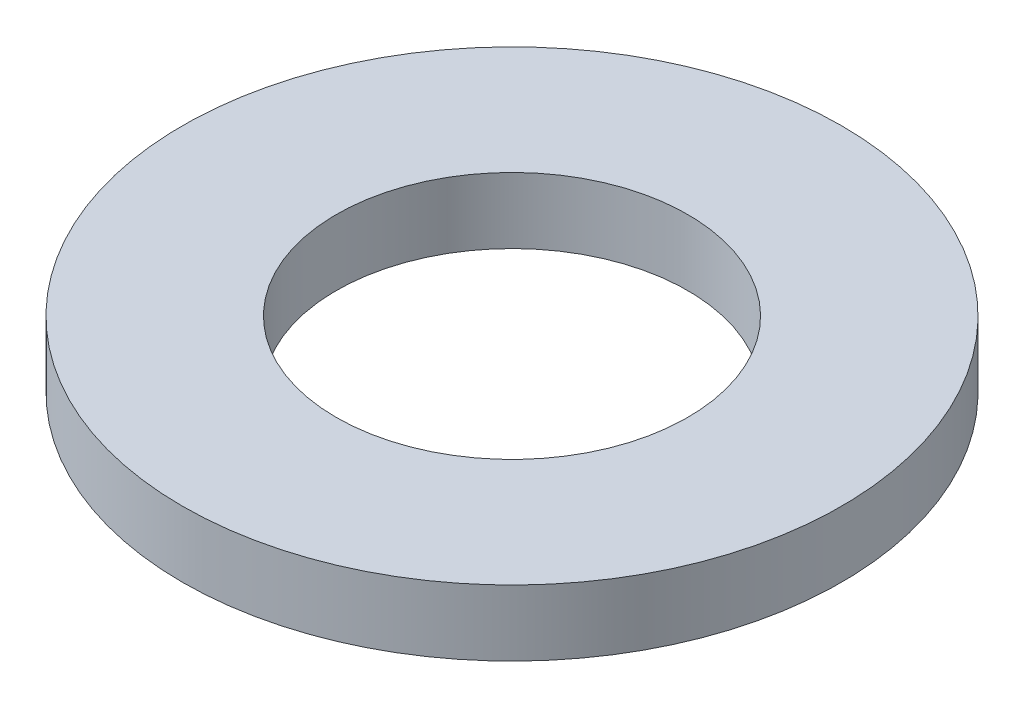
ISO-10303-21;
HEADER;
FILE_DESCRIPTION(('STEP AP214'),'2;1');
FILE_NAME('part.step','',(''),(''),'','','');
FILE_SCHEMA(('AUTOMOTIVE_DESIGN { 1 0 10303 214 1 1 1 1 }'));
ENDSEC;
DATA;
#1=APPLICATION_CONTEXT('core data for automotive mechanical design processes');
#2=APPLICATION_PROTOCOL_DEFINITION('international standard','automotive_design',2000,#1);
#3=PRODUCT_CONTEXT('',#1,'mechanical');
#4=PRODUCT('Part','Part','',(#3));
#5=PRODUCT_RELATED_PRODUCT_CATEGORY('part','',(#4));
#6=PRODUCT_DEFINITION_FORMATION('','',#4);
#7=PRODUCT_DEFINITION_CONTEXT('part definition',#1,'design');
#8=PRODUCT_DEFINITION('design','',#6,#7);
#9=PRODUCT_DEFINITION_SHAPE('','',#8);
#10=(LENGTH_UNIT() NAMED_UNIT(*) SI_UNIT(.MILLI.,.METRE.));
#11=(NAMED_UNIT(*) PLANE_ANGLE_UNIT() SI_UNIT($,.RADIAN.));
#12=(NAMED_UNIT(*) SI_UNIT($,.STERADIAN.) SOLID_ANGLE_UNIT());
#13=UNCERTAINTY_MEASURE_WITH_UNIT(LENGTH_MEASURE(1.E-05),#10,'distance_accuracy_value','');
#14=(GEOMETRIC_REPRESENTATION_CONTEXT(3) GLOBAL_UNCERTAINTY_ASSIGNED_CONTEXT((#13)) GLOBAL_UNIT_ASSIGNED_CONTEXT((#10,
#11,#12)) REPRESENTATION_CONTEXT('',''));
#15=CARTESIAN_POINT('',(0.,0.,0.));
#16=DIRECTION('',(0.,0.,1.));
#17=DIRECTION('',(1.,0.,0.));
#18=AXIS2_PLACEMENT_3D('',#15,#16,#17);
#19=CARTESIAN_POINT('',(0.,1.5,0.));
#20=DIRECTION('',(0.,1.,0.));
#21=DIRECTION('',(0.,0.,1.));
#22=AXIS2_PLACEMENT_3D('',#19,#20,#21);
#23=PLANE('',#22);
#24=CARTESIAN_POINT('',(0.,1.5,0.));
#25=DIRECTION('',(0.,1.,0.));
#26=DIRECTION('',(0.,0.,1.));
#27=AXIS2_PLACEMENT_3D('',#24,#25,#26);
#28=CIRCLE('',#27,7.5);
#29=CARTESIAN_POINT('',(0.,1.5,7.5));
#30=VERTEX_POINT('',#29);
#31=EDGE_CURVE('E10',#30,#30,#28,.T.);
#32=ORIENTED_EDGE('',*,*,#31,.T.);
#33=EDGE_LOOP('',(#32));
#34=FACE_BOUND('',#33,.T.);
#35=CARTESIAN_POINT('',(0.,1.5,0.));
#36=DIRECTION('',(0.,1.,0.));
#37=DIRECTION('',(0.,0.,1.));
#38=AXIS2_PLACEMENT_3D('',#35,#36,#37);
#39=CIRCLE('',#38,4.);
#40=CARTESIAN_POINT('',(0.,1.5,4.));
#41=VERTEX_POINT('',#40);
#42=EDGE_CURVE('E56',#41,#41,#39,.T.);
#43=ORIENTED_EDGE('',*,*,#42,.F.);
#44=EDGE_LOOP('',(#43));
#45=FACE_BOUND('',#44,.T.);
#46=ADVANCED_FACE('F43',(#34,#45),#23,.T.);
#47=CARTESIAN_POINT('',(0.,0.,0.));
#48=DIRECTION('',(0.,1.,0.));
#49=DIRECTION('',(0.,0.,1.));
#50=AXIS2_PLACEMENT_3D('',#47,#48,#49);
#51=PLANE('',#50);
#52=CARTESIAN_POINT('',(0.,0.,0.));
#53=DIRECTION('',(0.,1.,0.));
#54=DIRECTION('',(0.,0.,1.));
#55=AXIS2_PLACEMENT_3D('',#52,#53,#54);
#56=CIRCLE('',#55,7.5);
#57=CARTESIAN_POINT('',(0.,0.,7.5));
#58=VERTEX_POINT('',#57);
#59=EDGE_CURVE('E47',#58,#58,#56,.T.);
#60=ORIENTED_EDGE('',*,*,#59,.F.);
#61=EDGE_LOOP('',(#60));
#62=FACE_BOUND('',#61,.T.);
#63=CARTESIAN_POINT('',(0.,0.,0.));
#64=DIRECTION('',(0.,1.,0.));
#65=DIRECTION('',(0.,0.,1.));
#66=AXIS2_PLACEMENT_3D('',#63,#64,#65);
#67=CIRCLE('',#66,4.);
#68=CARTESIAN_POINT('',(0.,0.,4.));
#69=VERTEX_POINT('',#68);
#70=EDGE_CURVE('E58',#69,#69,#67,.T.);
#71=ORIENTED_EDGE('',*,*,#70,.T.);
#72=EDGE_LOOP('',(#71));
#73=FACE_BOUND('',#72,.T.);
#74=ADVANCED_FACE('F70',(#62,#73),#51,.F.);
#75=CARTESIAN_POINT('',(0.,1.5,0.));
#76=DIRECTION('',(0.,-1.,0.));
#77=DIRECTION('',(0.,0.,-1.));
#78=AXIS2_PLACEMENT_3D('',#75,#76,#77);
#79=CYLINDRICAL_SURFACE('',#78,7.5);
#80=ORIENTED_EDGE('',*,*,#31,.F.);
#81=EDGE_LOOP('',(#80));
#82=FACE_BOUND('',#81,.T.);
#83=ORIENTED_EDGE('',*,*,#59,.T.);
#84=EDGE_LOOP('',(#83));
#85=FACE_BOUND('',#84,.T.);
#86=ADVANCED_FACE('F45',(#82,#85),#79,.T.);
#87=CARTESIAN_POINT('',(0.,1.5,0.));
#88=DIRECTION('',(0.,-1.,0.));
#89=DIRECTION('',(0.,0.,-1.));
#90=AXIS2_PLACEMENT_3D('',#87,#88,#89);
#91=CYLINDRICAL_SURFACE('',#90,4.);
#92=ORIENTED_EDGE('',*,*,#42,.T.);
#93=EDGE_LOOP('',(#92));
#94=FACE_BOUND('',#93,.T.);
#95=ORIENTED_EDGE('',*,*,#70,.F.);
#96=EDGE_LOOP('',(#95));
#97=FACE_BOUND('',#96,.T.);
#98=ADVANCED_FACE('F66',(#94,#97),#91,.F.);
#99=CLOSED_SHELL('',(#46,#74,#86,#98));
#100=MANIFOLD_SOLID_BREP('B2',#99);
#101=ADVANCED_BREP_SHAPE_REPRESENTATION('',(#18,#100),#14);
#102=SHAPE_DEFINITION_REPRESENTATION(#9,#101);
ENDSEC;
END-ISO-10303-21;
